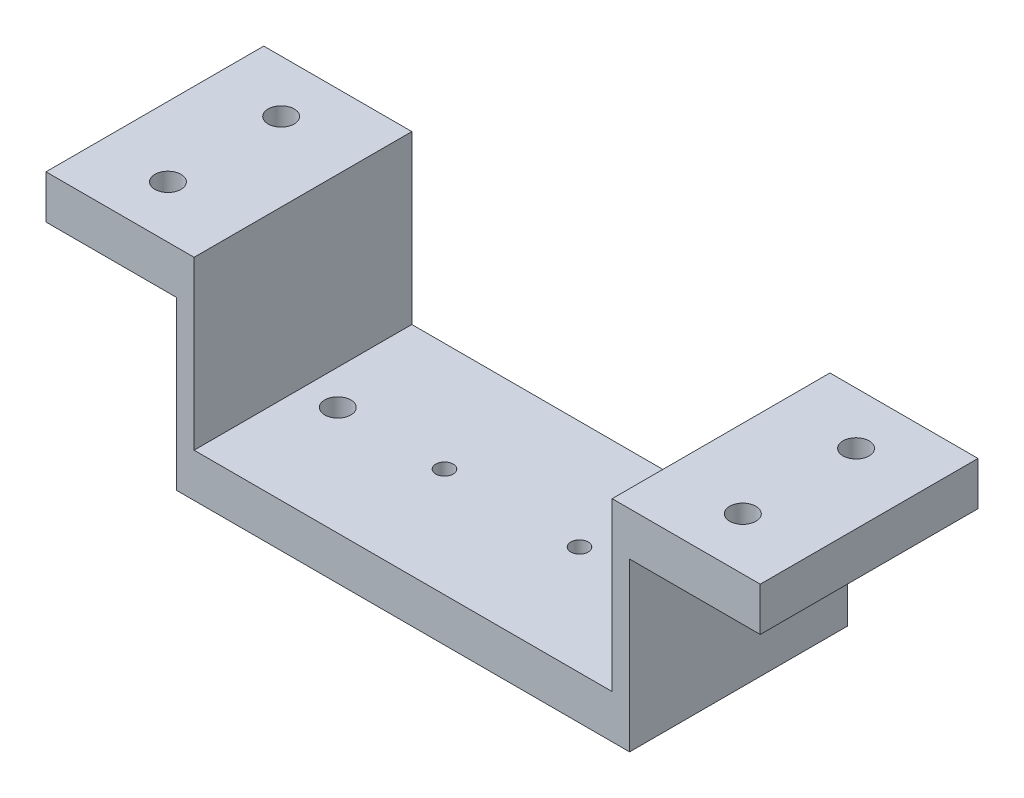
ISO-10303-21;
HEADER;
FILE_DESCRIPTION(('STEP AP214'),'2;1');
FILE_NAME('part.step','',(''),(''),'','','');
FILE_SCHEMA(('AUTOMOTIVE_DESIGN { 1 0 10303 214 1 1 1 1 }'));
ENDSEC;
DATA;
#1=APPLICATION_CONTEXT('core data for automotive mechanical design processes');
#2=APPLICATION_PROTOCOL_DEFINITION('international standard','automotive_design',2000,#1);
#3=PRODUCT_CONTEXT('',#1,'mechanical');
#4=PRODUCT('Part','Part','',(#3));
#5=PRODUCT_RELATED_PRODUCT_CATEGORY('part','',(#4));
#6=PRODUCT_DEFINITION_FORMATION('','',#4);
#7=PRODUCT_DEFINITION_CONTEXT('part definition',#1,'design');
#8=PRODUCT_DEFINITION('design','',#6,#7);
#9=PRODUCT_DEFINITION_SHAPE('','',#8);
#10=(LENGTH_UNIT() NAMED_UNIT(*) SI_UNIT(.MILLI.,.METRE.));
#11=(NAMED_UNIT(*) PLANE_ANGLE_UNIT() SI_UNIT($,.RADIAN.));
#12=(NAMED_UNIT(*) SI_UNIT($,.STERADIAN.) SOLID_ANGLE_UNIT());
#13=UNCERTAINTY_MEASURE_WITH_UNIT(LENGTH_MEASURE(1.E-05),#10,'distance_accuracy_value','');
#14=(GEOMETRIC_REPRESENTATION_CONTEXT(3) GLOBAL_UNCERTAINTY_ASSIGNED_CONTEXT((#13)) GLOBAL_UNIT_ASSIGNED_CONTEXT((#10,
#11,#12)) REPRESENTATION_CONTEXT('',''));
#15=CARTESIAN_POINT('',(0.,0.,0.));
#16=DIRECTION('',(0.,0.,1.));
#17=DIRECTION('',(1.,0.,0.));
#18=AXIS2_PLACEMENT_3D('',#15,#16,#17);
#19=CARTESIAN_POINT('',(26.,24.18,12.5));
#20=DIRECTION('',(-1.,0.,0.));
#21=DIRECTION('',(0.,0.,1.));
#22=AXIS2_PLACEMENT_3D('',#19,#20,#21);
#23=PLANE('',#22);
#24=DIRECTION('',(0.,0.,-1.));
#25=VECTOR('',#24,1.);
#26=CARTESIAN_POINT('',(26.,19.18,12.5));
#27=LINE('',#26,#25);
#28=CARTESIAN_POINT('',(26.,19.18,12.5));
#29=VERTEX_POINT('',#28);
#30=CARTESIAN_POINT('',(26.,19.18,-12.5));
#31=VERTEX_POINT('',#30);
#32=EDGE_CURVE('E59',#29,#31,#27,.T.);
#33=ORIENTED_EDGE('',*,*,#32,.F.);
#34=DIRECTION('',(0.,-1.,0.));
#35=VECTOR('',#34,1.);
#36=CARTESIAN_POINT('',(26.,24.18,12.5));
#37=LINE('',#36,#35);
#38=CARTESIAN_POINT('',(26.,0.,12.5));
#39=VERTEX_POINT('',#38);
#40=EDGE_CURVE('E138',#29,#39,#37,.T.);
#41=ORIENTED_EDGE('',*,*,#40,.T.);
#42=DIRECTION('',(0.,0.,-1.));
#43=VECTOR('',#42,1.);
#44=CARTESIAN_POINT('',(26.,0.,12.5));
#45=LINE('',#44,#43);
#46=CARTESIAN_POINT('',(26.,0.,-12.5));
#47=VERTEX_POINT('',#46);
#48=EDGE_CURVE('E227',#39,#47,#45,.T.);
#49=ORIENTED_EDGE('',*,*,#48,.T.);
#50=DIRECTION('',(0.,-1.,0.));
#51=VECTOR('',#50,1.);
#52=CARTESIAN_POINT('',(26.,24.18,-12.5));
#53=LINE('',#52,#51);
#54=EDGE_CURVE('E249',#31,#47,#53,.T.);
#55=ORIENTED_EDGE('',*,*,#54,.F.);
#56=EDGE_LOOP('',(#33,#41,#49,#55));
#57=FACE_BOUND('',#56,.T.);
#58=ADVANCED_FACE('F35',(#57),#23,.F.);
#59=CARTESIAN_POINT('',(0.,24.18,0.));
#60=DIRECTION('',(0.,-1.,0.));
#61=DIRECTION('',(0.,0.,-1.));
#62=AXIS2_PLACEMENT_3D('',#59,#60,#61);
#63=PLANE('',#62);
#64=CARTESIAN_POINT('',(33.,24.18,6.5));
#65=DIRECTION('',(0.,-1.,0.));
#66=DIRECTION('',(0.,0.,-1.));
#67=AXIS2_PLACEMENT_3D('',#64,#65,#66);
#68=CIRCLE('',#67,1.5);
#69=CARTESIAN_POINT('',(33.,24.18,5.));
#70=VERTEX_POINT('',#69);
#71=EDGE_CURVE('E164',#70,#70,#68,.T.);
#72=ORIENTED_EDGE('',*,*,#71,.T.);
#73=EDGE_LOOP('',(#72));
#74=FACE_BOUND('',#73,.T.);
#75=CARTESIAN_POINT('',(33.,24.18,-6.5));
#76=DIRECTION('',(0.,1.,0.));
#77=DIRECTION('',(0.,0.,1.));
#78=AXIS2_PLACEMENT_3D('',#75,#76,#77);
#79=CIRCLE('',#78,1.5);
#80=CARTESIAN_POINT('',(33.,24.18,-5.));
#81=VERTEX_POINT('',#80);
#82=EDGE_CURVE('E170',#81,#81,#79,.T.);
#83=ORIENTED_EDGE('',*,*,#82,.F.);
#84=EDGE_LOOP('',(#83));
#85=FACE_BOUND('',#84,.T.);
#86=DIRECTION('',(-1.,0.,0.));
#87=VECTOR('',#86,1.);
#88=CARTESIAN_POINT('',(-26.,24.18,-12.5));
#89=LINE('',#88,#87);
#90=CARTESIAN_POINT('',(41.,24.18,-12.5));
#91=VERTEX_POINT('',#90);
#92=CARTESIAN_POINT('',(24.,24.18,-12.5));
#93=VERTEX_POINT('',#92);
#94=EDGE_CURVE('E230',#91,#93,#89,.T.);
#95=ORIENTED_EDGE('',*,*,#94,.T.);
#96=DIRECTION('',(0.,0.,1.));
#97=VECTOR('',#96,1.);
#98=CARTESIAN_POINT('',(24.,24.18,0.));
#99=LINE('',#98,#97);
#100=CARTESIAN_POINT('',(24.,24.18,12.5));
#101=VERTEX_POINT('',#100);
#102=EDGE_CURVE('E11',#93,#101,#99,.T.);
#103=ORIENTED_EDGE('',*,*,#102,.T.);
#104=DIRECTION('',(1.,0.,0.));
#105=VECTOR('',#104,1.);
#106=CARTESIAN_POINT('',(-26.,24.18,12.5));
#107=LINE('',#106,#105);
#108=CARTESIAN_POINT('',(41.,24.18,12.5));
#109=VERTEX_POINT('',#108);
#110=EDGE_CURVE('E139',#101,#109,#107,.T.);
#111=ORIENTED_EDGE('',*,*,#110,.T.);
#112=DIRECTION('',(0.,0.,1.));
#113=VECTOR('',#112,1.);
#114=CARTESIAN_POINT('',(41.,24.18,12.5));
#115=LINE('',#114,#113);
#116=EDGE_CURVE('E184',#91,#109,#115,.T.);
#117=ORIENTED_EDGE('',*,*,#116,.F.);
#118=EDGE_LOOP('',(#95,#103,#111,#117));
#119=FACE_BOUND('',#118,.T.);
#120=ADVANCED_FACE('F278',(#74,#85,#119),#63,.F.);
#121=CARTESIAN_POINT('',(-26.,24.18,-12.5));
#122=DIRECTION('',(0.,0.,1.));
#123=DIRECTION('',(1.,0.,0.));
#124=AXIS2_PLACEMENT_3D('',#121,#122,#123);
#125=PLANE('',#124);
#126=DIRECTION('',(1.,0.,0.));
#127=VECTOR('',#126,1.);
#128=CARTESIAN_POINT('',(-24.,5.,-12.5));
#129=LINE('',#128,#127);
#130=CARTESIAN_POINT('',(-24.,5.,-12.5));
#131=VERTEX_POINT('',#130);
#132=CARTESIAN_POINT('',(24.,5.,-12.5));
#133=VERTEX_POINT('',#132);
#134=EDGE_CURVE('E216',#131,#133,#129,.T.);
#135=ORIENTED_EDGE('',*,*,#134,.T.);
#136=DIRECTION('',(0.,1.,0.));
#137=VECTOR('',#136,1.);
#138=CARTESIAN_POINT('',(24.,5.,-12.5));
#139=LINE('',#138,#137);
#140=EDGE_CURVE('E209',#133,#93,#139,.T.);
#141=ORIENTED_EDGE('',*,*,#140,.T.);
#142=ORIENTED_EDGE('',*,*,#94,.F.);
#143=DIRECTION('',(0.,1.,0.));
#144=VECTOR('',#143,1.);
#145=CARTESIAN_POINT('',(41.,24.18,-12.5));
#146=LINE('',#145,#144);
#147=CARTESIAN_POINT('',(41.,19.18,-12.5));
#148=VERTEX_POINT('',#147);
#149=EDGE_CURVE('E181',#148,#91,#146,.T.);
#150=ORIENTED_EDGE('',*,*,#149,.F.);
#151=DIRECTION('',(-1.,0.,0.));
#152=VECTOR('',#151,1.);
#153=CARTESIAN_POINT('',(41.,19.18,-12.5));
#154=LINE('',#153,#152);
#155=EDGE_CURVE('E187',#148,#31,#154,.T.);
#156=ORIENTED_EDGE('',*,*,#155,.T.);
#157=ORIENTED_EDGE('',*,*,#54,.T.);
#158=DIRECTION('',(-1.,0.,0.));
#159=VECTOR('',#158,1.);
#160=CARTESIAN_POINT('',(-26.,0.,-12.5));
#161=LINE('',#160,#159);
#162=CARTESIAN_POINT('',(-26.,0.,-12.5));
#163=VERTEX_POINT('',#162);
#164=EDGE_CURVE('E235',#47,#163,#161,.T.);
#165=ORIENTED_EDGE('',*,*,#164,.T.);
#166=DIRECTION('',(0.,-1.,0.));
#167=VECTOR('',#166,1.);
#168=CARTESIAN_POINT('',(-26.,24.18,-12.5));
#169=LINE('',#168,#167);
#170=CARTESIAN_POINT('',(-26.,19.18,-12.5));
#171=VERTEX_POINT('',#170);
#172=EDGE_CURVE('E247',#171,#163,#169,.T.);
#173=ORIENTED_EDGE('',*,*,#172,.F.);
#174=DIRECTION('',(1.,0.,0.));
#175=VECTOR('',#174,1.);
#176=CARTESIAN_POINT('',(-41.,19.18,-12.5));
#177=LINE('',#176,#175);
#178=CARTESIAN_POINT('',(-41.,19.18,-12.5));
#179=VERTEX_POINT('',#178);
#180=EDGE_CURVE('E51',#179,#171,#177,.T.);
#181=ORIENTED_EDGE('',*,*,#180,.F.);
#182=DIRECTION('',(0.,1.,0.));
#183=VECTOR('',#182,1.);
#184=CARTESIAN_POINT('',(-41.,24.18,-12.5));
#185=LINE('',#184,#183);
#186=CARTESIAN_POINT('',(-41.,24.18,-12.5));
#187=VERTEX_POINT('',#186);
#188=EDGE_CURVE('E153',#179,#187,#185,.T.);
#189=ORIENTED_EDGE('',*,*,#188,.T.);
#190=CARTESIAN_POINT('',(-24.,24.18,-12.5));
#191=VERTEX_POINT('',#190);
#192=EDGE_CURVE('E152',#191,#187,#89,.T.);
#193=ORIENTED_EDGE('',*,*,#192,.F.);
#194=DIRECTION('',(0.,-1.,0.));
#195=VECTOR('',#194,1.);
#196=CARTESIAN_POINT('',(-24.,5.,-12.5));
#197=LINE('',#196,#195);
#198=EDGE_CURVE('E212',#191,#131,#197,.T.);
#199=ORIENTED_EDGE('',*,*,#198,.T.);
#200=EDGE_LOOP('',(#135,#141,#142,#150,#156,#157,#165,#173,#181,#189,#193,#199));
#201=FACE_BOUND('',#200,.T.);
#202=ADVANCED_FACE('F282',(#201),#125,.F.);
#203=CARTESIAN_POINT('',(-26.,24.18,12.5));
#204=DIRECTION('',(1.,0.,0.));
#205=DIRECTION('',(0.,0.,-1.));
#206=AXIS2_PLACEMENT_3D('',#203,#204,#205);
#207=PLANE('',#206);
#208=DIRECTION('',(0.,-1.,0.));
#209=VECTOR('',#208,1.);
#210=CARTESIAN_POINT('',(-26.,24.18,12.5));
#211=LINE('',#210,#209);
#212=CARTESIAN_POINT('',(-26.,19.18,12.5));
#213=VERTEX_POINT('',#212);
#214=CARTESIAN_POINT('',(-26.,0.,12.5));
#215=VERTEX_POINT('',#214);
#216=EDGE_CURVE('E245',#213,#215,#211,.T.);
#217=ORIENTED_EDGE('',*,*,#216,.F.);
#218=DIRECTION('',(0.,0.,-1.));
#219=VECTOR('',#218,1.);
#220=CARTESIAN_POINT('',(-26.,19.18,12.5));
#221=LINE('',#220,#219);
#222=EDGE_CURVE('E148',#213,#171,#221,.T.);
#223=ORIENTED_EDGE('',*,*,#222,.T.);
#224=ORIENTED_EDGE('',*,*,#172,.T.);
#225=DIRECTION('',(0.,0.,1.));
#226=VECTOR('',#225,1.);
#227=CARTESIAN_POINT('',(-26.,0.,12.5));
#228=LINE('',#227,#226);
#229=EDGE_CURVE('E238',#163,#215,#228,.T.);
#230=ORIENTED_EDGE('',*,*,#229,.T.);
#231=EDGE_LOOP('',(#217,#223,#224,#230));
#232=FACE_BOUND('',#231,.T.);
#233=ADVANCED_FACE('F288',(#232),#207,.F.);
#234=CARTESIAN_POINT('',(-26.,24.18,12.5));
#235=DIRECTION('',(0.,0.,-1.));
#236=DIRECTION('',(-1.,0.,0.));
#237=AXIS2_PLACEMENT_3D('',#234,#235,#236);
#238=PLANE('',#237);
#239=ORIENTED_EDGE('',*,*,#110,.F.);
#240=DIRECTION('',(0.,1.,0.));
#241=VECTOR('',#240,1.);
#242=CARTESIAN_POINT('',(24.,5.,12.5));
#243=LINE('',#242,#241);
#244=CARTESIAN_POINT('',(24.,5.,12.5));
#245=VERTEX_POINT('',#244);
#246=EDGE_CURVE('E220',#245,#101,#243,.T.);
#247=ORIENTED_EDGE('',*,*,#246,.F.);
#248=DIRECTION('',(1.,0.,0.));
#249=VECTOR('',#248,1.);
#250=CARTESIAN_POINT('',(-24.,5.,12.5));
#251=LINE('',#250,#249);
#252=CARTESIAN_POINT('',(-24.,5.,12.5));
#253=VERTEX_POINT('',#252);
#254=EDGE_CURVE('E213',#253,#245,#251,.T.);
#255=ORIENTED_EDGE('',*,*,#254,.F.);
#256=DIRECTION('',(0.,-1.,0.));
#257=VECTOR('',#256,1.);
#258=CARTESIAN_POINT('',(-24.,5.,12.5));
#259=LINE('',#258,#257);
#260=CARTESIAN_POINT('',(-24.,24.18,12.5));
#261=VERTEX_POINT('',#260);
#262=EDGE_CURVE('E134',#261,#253,#259,.T.);
#263=ORIENTED_EDGE('',*,*,#262,.F.);
#264=CARTESIAN_POINT('',(-41.,24.18,12.5));
#265=VERTEX_POINT('',#264);
#266=EDGE_CURVE('E127',#265,#261,#107,.T.);
#267=ORIENTED_EDGE('',*,*,#266,.F.);
#268=DIRECTION('',(0.,-1.,0.));
#269=VECTOR('',#268,1.);
#270=CARTESIAN_POINT('',(-41.,24.18,12.5));
#271=LINE('',#270,#269);
#272=CARTESIAN_POINT('',(-41.,19.18,12.5));
#273=VERTEX_POINT('',#272);
#274=EDGE_CURVE('E131',#265,#273,#271,.T.);
#275=ORIENTED_EDGE('',*,*,#274,.T.);
#276=DIRECTION('',(1.,0.,0.));
#277=VECTOR('',#276,1.);
#278=CARTESIAN_POINT('',(-41.,19.18,12.5));
#279=LINE('',#278,#277);
#280=EDGE_CURVE('E159',#273,#213,#279,.T.);
#281=ORIENTED_EDGE('',*,*,#280,.T.);
#282=ORIENTED_EDGE('',*,*,#216,.T.);
#283=DIRECTION('',(1.,0.,0.));
#284=VECTOR('',#283,1.);
#285=CARTESIAN_POINT('',(-26.,0.,12.5));
#286=LINE('',#285,#284);
#287=EDGE_CURVE('E241',#215,#39,#286,.T.);
#288=ORIENTED_EDGE('',*,*,#287,.T.);
#289=ORIENTED_EDGE('',*,*,#40,.F.);
#290=DIRECTION('',(-1.,0.,0.));
#291=VECTOR('',#290,1.);
#292=CARTESIAN_POINT('',(41.,19.18,12.5));
#293=LINE('',#292,#291);
#294=CARTESIAN_POINT('',(41.,19.18,12.5));
#295=VERTEX_POINT('',#294);
#296=EDGE_CURVE('E191',#295,#29,#293,.T.);
#297=ORIENTED_EDGE('',*,*,#296,.F.);
#298=DIRECTION('',(0.,-1.,0.));
#299=VECTOR('',#298,1.);
#300=CARTESIAN_POINT('',(41.,24.18,12.5));
#301=LINE('',#300,#299);
#302=EDGE_CURVE('E176',#109,#295,#301,.T.);
#303=ORIENTED_EDGE('',*,*,#302,.F.);
#304=EDGE_LOOP('',(#239,#247,#255,#263,#267,#275,#281,#282,#288,#289,#297,#303));
#305=FACE_BOUND('',#304,.T.);
#306=ADVANCED_FACE('F130',(#305),#238,.F.);
#307=CARTESIAN_POINT('',(-33.,24.18,6.5));
#308=DIRECTION('',(0.,1.,0.));
#309=DIRECTION('',(0.,0.,-1.));
#310=AXIS2_PLACEMENT_3D('',#307,#308,#309);
#311=CIRCLE('',#310,1.5);
#312=CARTESIAN_POINT('',(-33.,24.18,5.));
#313=VERTEX_POINT('',#312);
#314=EDGE_CURVE('E306',#313,#313,#311,.T.);
#315=ORIENTED_EDGE('',*,*,#314,.F.);
#316=EDGE_LOOP('',(#315));
#317=FACE_BOUND('',#316,.T.);
#318=CARTESIAN_POINT('',(-33.,24.18,-6.5));
#319=DIRECTION('',(0.,-1.,0.));
#320=DIRECTION('',(0.,0.,1.));
#321=AXIS2_PLACEMENT_3D('',#318,#319,#320);
#322=CIRCLE('',#321,1.5);
#323=CARTESIAN_POINT('',(-33.,24.18,-5.));
#324=VERTEX_POINT('',#323);
#325=EDGE_CURVE('E309',#324,#324,#322,.T.);
#326=ORIENTED_EDGE('',*,*,#325,.T.);
#327=EDGE_LOOP('',(#326));
#328=FACE_BOUND('',#327,.T.);
#329=ORIENTED_EDGE('',*,*,#266,.T.);
#330=DIRECTION('',(0.,0.,-1.));
#331=VECTOR('',#330,1.);
#332=CARTESIAN_POINT('',(-24.,24.18,0.));
#333=LINE('',#332,#331);
#334=EDGE_CURVE('E43',#261,#191,#333,.T.);
#335=ORIENTED_EDGE('',*,*,#334,.T.);
#336=ORIENTED_EDGE('',*,*,#192,.T.);
#337=DIRECTION('',(0.,0.,1.));
#338=VECTOR('',#337,1.);
#339=CARTESIAN_POINT('',(-41.,24.18,12.5));
#340=LINE('',#339,#338);
#341=EDGE_CURVE('E145',#187,#265,#340,.T.);
#342=ORIENTED_EDGE('',*,*,#341,.T.);
#343=EDGE_LOOP('',(#329,#335,#336,#342));
#344=FACE_BOUND('',#343,.T.);
#345=ADVANCED_FACE('F150',(#317,#328,#344),#63,.F.);
#346=CARTESIAN_POINT('',(0.,0.,0.));
#347=DIRECTION('',(0.,-1.,0.));
#348=DIRECTION('',(0.,0.,-1.));
#349=AXIS2_PLACEMENT_3D('',#346,#347,#348);
#350=PLANE('',#349);
#351=CARTESIAN_POINT('',(20.,0.,0.));
#352=DIRECTION('',(0.,-1.,0.));
#353=DIRECTION('',(0.,0.,-1.));
#354=AXIS2_PLACEMENT_3D('',#351,#352,#353);
#355=CIRCLE('',#354,1.5);
#356=CARTESIAN_POINT('',(20.,0.,-1.5));
#357=VERTEX_POINT('',#356);
#358=EDGE_CURVE('E194',#357,#357,#355,.T.);
#359=ORIENTED_EDGE('',*,*,#358,.F.);
#360=EDGE_LOOP('',(#359));
#361=FACE_BOUND('',#360,.T.);
#362=CARTESIAN_POINT('',(7.75,0.,0.));
#363=DIRECTION('',(0.,-1.,0.));
#364=DIRECTION('',(0.,0.,-1.));
#365=AXIS2_PLACEMENT_3D('',#362,#363,#364);
#366=CIRCLE('',#365,1.);
#367=CARTESIAN_POINT('',(7.75,0.,-1.));
#368=VERTEX_POINT('',#367);
#369=EDGE_CURVE('E197',#368,#368,#366,.T.);
#370=ORIENTED_EDGE('',*,*,#369,.F.);
#371=EDGE_LOOP('',(#370));
#372=FACE_BOUND('',#371,.T.);
#373=CARTESIAN_POINT('',(-20.,0.,0.));
#374=DIRECTION('',(0.,-1.,0.));
#375=DIRECTION('',(0.,0.,-1.));
#376=AXIS2_PLACEMENT_3D('',#373,#374,#375);
#377=CIRCLE('',#376,1.5);
#378=CARTESIAN_POINT('',(-20.,0.,-1.5));
#379=VERTEX_POINT('',#378);
#380=EDGE_CURVE('E201',#379,#379,#377,.T.);
#381=ORIENTED_EDGE('',*,*,#380,.F.);
#382=EDGE_LOOP('',(#381));
#383=FACE_BOUND('',#382,.T.);
#384=CARTESIAN_POINT('',(-7.75,0.,0.));
#385=DIRECTION('',(0.,-1.,0.));
#386=DIRECTION('',(0.,0.,-1.));
#387=AXIS2_PLACEMENT_3D('',#384,#385,#386);
#388=CIRCLE('',#387,1.);
#389=CARTESIAN_POINT('',(-7.75,0.,-1.));
#390=VERTEX_POINT('',#389);
#391=EDGE_CURVE('E205',#390,#390,#388,.T.);
#392=ORIENTED_EDGE('',*,*,#391,.F.);
#393=EDGE_LOOP('',(#392));
#394=FACE_BOUND('',#393,.T.);
#395=ORIENTED_EDGE('',*,*,#48,.F.);
#396=ORIENTED_EDGE('',*,*,#287,.F.);
#397=ORIENTED_EDGE('',*,*,#229,.F.);
#398=ORIENTED_EDGE('',*,*,#164,.F.);
#399=EDGE_LOOP('',(#395,#396,#397,#398));
#400=FACE_BOUND('',#399,.T.);
#401=ADVANCED_FACE('F294',(#361,#372,#383,#394,#400),#350,.T.);
#402=CARTESIAN_POINT('',(24.,5.,-12.5));
#403=DIRECTION('',(1.,0.,0.));
#404=DIRECTION('',(0.,0.,-1.));
#405=AXIS2_PLACEMENT_3D('',#402,#403,#404);
#406=PLANE('',#405);
#407=ORIENTED_EDGE('',*,*,#140,.F.);
#408=DIRECTION('',(0.,0.,1.));
#409=VECTOR('',#408,1.);
#410=CARTESIAN_POINT('',(24.,5.,-12.5));
#411=LINE('',#410,#409);
#412=EDGE_CURVE('E225',#133,#245,#411,.T.);
#413=ORIENTED_EDGE('',*,*,#412,.T.);
#414=ORIENTED_EDGE('',*,*,#246,.T.);
#415=ORIENTED_EDGE('',*,*,#102,.F.);
#416=EDGE_LOOP('',(#407,#413,#414,#415));
#417=FACE_BOUND('',#416,.T.);
#418=ADVANCED_FACE('F300',(#417),#406,.F.);
#419=CARTESIAN_POINT('',(-24.,5.,-12.5));
#420=DIRECTION('',(-1.,0.,0.));
#421=DIRECTION('',(0.,0.,1.));
#422=AXIS2_PLACEMENT_3D('',#419,#420,#421);
#423=PLANE('',#422);
#424=ORIENTED_EDGE('',*,*,#262,.T.);
#425=DIRECTION('',(0.,0.,1.));
#426=VECTOR('',#425,1.);
#427=CARTESIAN_POINT('',(-24.,5.,-12.5));
#428=LINE('',#427,#426);
#429=EDGE_CURVE('E219',#131,#253,#428,.T.);
#430=ORIENTED_EDGE('',*,*,#429,.F.);
#431=ORIENTED_EDGE('',*,*,#198,.F.);
#432=ORIENTED_EDGE('',*,*,#334,.F.);
#433=EDGE_LOOP('',(#424,#430,#431,#432));
#434=FACE_BOUND('',#433,.T.);
#435=ADVANCED_FACE('F463',(#434),#423,.F.);
#436=CARTESIAN_POINT('',(-24.,5.,-12.5));
#437=DIRECTION('',(0.,-1.,0.));
#438=DIRECTION('',(0.,0.,-1.));
#439=AXIS2_PLACEMENT_3D('',#436,#437,#438);
#440=PLANE('',#439);
#441=CARTESIAN_POINT('',(20.,5.,0.));
#442=DIRECTION('',(0.,-1.,0.));
#443=DIRECTION('',(0.,0.,-1.));
#444=AXIS2_PLACEMENT_3D('',#441,#442,#443);
#445=CIRCLE('',#444,1.5);
#446=CARTESIAN_POINT('',(20.,5.,-1.5));
#447=VERTEX_POINT('',#446);
#448=EDGE_CURVE('E38',#447,#447,#445,.T.);
#449=ORIENTED_EDGE('',*,*,#448,.T.);
#450=EDGE_LOOP('',(#449));
#451=FACE_BOUND('',#450,.T.);
#452=CARTESIAN_POINT('',(7.75,5.,0.));
#453=DIRECTION('',(0.,-1.,0.));
#454=DIRECTION('',(0.,0.,-1.));
#455=AXIS2_PLACEMENT_3D('',#452,#453,#454);
#456=CIRCLE('',#455,1.);
#457=CARTESIAN_POINT('',(7.75,5.,-1.));
#458=VERTEX_POINT('',#457);
#459=EDGE_CURVE('E200',#458,#458,#456,.T.);
#460=ORIENTED_EDGE('',*,*,#459,.T.);
#461=EDGE_LOOP('',(#460));
#462=FACE_BOUND('',#461,.T.);
#463=CARTESIAN_POINT('',(-20.,5.,0.));
#464=DIRECTION('',(0.,-1.,0.));
#465=DIRECTION('',(0.,0.,-1.));
#466=AXIS2_PLACEMENT_3D('',#463,#464,#465);
#467=CIRCLE('',#466,1.5);
#468=CARTESIAN_POINT('',(-20.,5.,-1.5));
#469=VERTEX_POINT('',#468);
#470=EDGE_CURVE('E204',#469,#469,#467,.T.);
#471=ORIENTED_EDGE('',*,*,#470,.T.);
#472=EDGE_LOOP('',(#471));
#473=FACE_BOUND('',#472,.T.);
#474=CARTESIAN_POINT('',(-7.75,5.,0.));
#475=DIRECTION('',(0.,-1.,0.));
#476=DIRECTION('',(0.,0.,-1.));
#477=AXIS2_PLACEMENT_3D('',#474,#475,#476);
#478=CIRCLE('',#477,1.);
#479=CARTESIAN_POINT('',(-7.75,5.,-1.));
#480=VERTEX_POINT('',#479);
#481=EDGE_CURVE('E208',#480,#480,#478,.T.);
#482=ORIENTED_EDGE('',*,*,#481,.T.);
#483=EDGE_LOOP('',(#482));
#484=FACE_BOUND('',#483,.T.);
#485=ORIENTED_EDGE('',*,*,#254,.T.);
#486=ORIENTED_EDGE('',*,*,#412,.F.);
#487=ORIENTED_EDGE('',*,*,#134,.F.);
#488=ORIENTED_EDGE('',*,*,#429,.T.);
#489=EDGE_LOOP('',(#485,#486,#487,#488));
#490=FACE_BOUND('',#489,.T.);
#491=ADVANCED_FACE('F258',(#451,#462,#473,#484,#490),#440,.F.);
#492=CARTESIAN_POINT('',(-7.75,24.18,0.));
#493=DIRECTION('',(0.,-1.,0.));
#494=DIRECTION('',(0.,0.,-1.));
#495=AXIS2_PLACEMENT_3D('',#492,#493,#494);
#496=CYLINDRICAL_SURFACE('',#495,1.);
#497=ORIENTED_EDGE('',*,*,#391,.T.);
#498=EDGE_LOOP('',(#497));
#499=FACE_BOUND('',#498,.T.);
#500=ORIENTED_EDGE('',*,*,#481,.F.);
#501=EDGE_LOOP('',(#500));
#502=FACE_BOUND('',#501,.T.);
#503=ADVANCED_FACE('F274',(#499,#502),#496,.F.);
#504=CARTESIAN_POINT('',(-20.,24.18,0.));
#505=DIRECTION('',(0.,-1.,0.));
#506=DIRECTION('',(0.,0.,-1.));
#507=AXIS2_PLACEMENT_3D('',#504,#505,#506);
#508=CYLINDRICAL_SURFACE('',#507,1.5);
#509=ORIENTED_EDGE('',*,*,#380,.T.);
#510=EDGE_LOOP('',(#509));
#511=FACE_BOUND('',#510,.T.);
#512=ORIENTED_EDGE('',*,*,#470,.F.);
#513=EDGE_LOOP('',(#512));
#514=FACE_BOUND('',#513,.T.);
#515=ADVANCED_FACE('F264',(#511,#514),#508,.F.);
#516=CARTESIAN_POINT('',(7.75,24.18,0.));
#517=DIRECTION('',(0.,-1.,0.));
#518=DIRECTION('',(0.,0.,-1.));
#519=AXIS2_PLACEMENT_3D('',#516,#517,#518);
#520=CYLINDRICAL_SURFACE('',#519,1.);
#521=ORIENTED_EDGE('',*,*,#369,.T.);
#522=EDGE_LOOP('',(#521));
#523=FACE_BOUND('',#522,.T.);
#524=ORIENTED_EDGE('',*,*,#459,.F.);
#525=EDGE_LOOP('',(#524));
#526=FACE_BOUND('',#525,.T.);
#527=ADVANCED_FACE('F261',(#523,#526),#520,.F.);
#528=CARTESIAN_POINT('',(20.,24.18,0.));
#529=DIRECTION('',(0.,-1.,0.));
#530=DIRECTION('',(0.,0.,-1.));
#531=AXIS2_PLACEMENT_3D('',#528,#529,#530);
#532=CYLINDRICAL_SURFACE('',#531,1.5);
#533=ORIENTED_EDGE('',*,*,#358,.T.);
#534=EDGE_LOOP('',(#533));
#535=FACE_BOUND('',#534,.T.);
#536=ORIENTED_EDGE('',*,*,#448,.F.);
#537=EDGE_LOOP('',(#536));
#538=FACE_BOUND('',#537,.T.);
#539=ADVANCED_FACE('F263',(#535,#538),#532,.F.);
#540=CARTESIAN_POINT('',(41.,19.18,12.5));
#541=DIRECTION('',(0.,1.,0.));
#542=DIRECTION('',(0.,0.,1.));
#543=AXIS2_PLACEMENT_3D('',#540,#541,#542);
#544=PLANE('',#543);
#545=CARTESIAN_POINT('',(33.,19.18,6.5));
#546=DIRECTION('',(0.,1.,0.));
#547=DIRECTION('',(0.,0.,1.));
#548=AXIS2_PLACEMENT_3D('',#545,#546,#547);
#549=CIRCLE('',#548,1.5);
#550=CARTESIAN_POINT('',(33.,19.18,8.));
#551=VERTEX_POINT('',#550);
#552=EDGE_CURVE('E167',#551,#551,#549,.T.);
#553=ORIENTED_EDGE('',*,*,#552,.T.);
#554=EDGE_LOOP('',(#553));
#555=FACE_BOUND('',#554,.T.);
#556=CARTESIAN_POINT('',(33.,19.18,-6.5));
#557=DIRECTION('',(0.,1.,0.));
#558=DIRECTION('',(0.,0.,1.));
#559=AXIS2_PLACEMENT_3D('',#556,#557,#558);
#560=CIRCLE('',#559,1.5);
#561=CARTESIAN_POINT('',(33.,19.18,-5.));
#562=VERTEX_POINT('',#561);
#563=EDGE_CURVE('E173',#562,#562,#560,.F.);
#564=ORIENTED_EDGE('',*,*,#563,.F.);
#565=EDGE_LOOP('',(#564));
#566=FACE_BOUND('',#565,.T.);
#567=ORIENTED_EDGE('',*,*,#32,.T.);
#568=ORIENTED_EDGE('',*,*,#155,.F.);
#569=DIRECTION('',(0.,0.,-1.));
#570=VECTOR('',#569,1.);
#571=CARTESIAN_POINT('',(41.,19.18,12.5));
#572=LINE('',#571,#570);
#573=EDGE_CURVE('E179',#295,#148,#572,.T.);
#574=ORIENTED_EDGE('',*,*,#573,.F.);
#575=ORIENTED_EDGE('',*,*,#296,.T.);
#576=EDGE_LOOP('',(#567,#568,#574,#575));
#577=FACE_BOUND('',#576,.T.);
#578=ADVANCED_FACE('F271',(#555,#566,#577),#544,.F.);
#579=CARTESIAN_POINT('',(41.,0.,0.));
#580=DIRECTION('',(1.,0.,0.));
#581=DIRECTION('',(0.,0.,-1.));
#582=AXIS2_PLACEMENT_3D('',#579,#580,#581);
#583=PLANE('',#582);
#584=ORIENTED_EDGE('',*,*,#302,.T.);
#585=ORIENTED_EDGE('',*,*,#573,.T.);
#586=ORIENTED_EDGE('',*,*,#149,.T.);
#587=ORIENTED_EDGE('',*,*,#116,.T.);
#588=EDGE_LOOP('',(#584,#585,#586,#587));
#589=FACE_BOUND('',#588,.T.);
#590=ADVANCED_FACE('F342',(#589),#583,.T.);
#591=CARTESIAN_POINT('',(33.,14.9373593128807,-6.5));
#592=DIRECTION('',(0.,1.,0.));
#593=DIRECTION('',(0.,0.,1.));
#594=AXIS2_PLACEMENT_3D('',#591,#592,#593);
#595=CYLINDRICAL_SURFACE('',#594,1.5);
#596=ORIENTED_EDGE('',*,*,#563,.T.);
#597=EDGE_LOOP('',(#596));
#598=FACE_BOUND('',#597,.T.);
#599=ORIENTED_EDGE('',*,*,#82,.T.);
#600=EDGE_LOOP('',(#599));
#601=FACE_BOUND('',#600,.T.);
#602=ADVANCED_FACE('F338',(#598,#601),#595,.F.);
#603=CARTESIAN_POINT('',(33.,14.9373593128807,6.5));
#604=DIRECTION('',(0.,1.,0.));
#605=DIRECTION('',(0.,0.,1.));
#606=AXIS2_PLACEMENT_3D('',#603,#604,#605);
#607=CYLINDRICAL_SURFACE('',#606,1.5);
#608=ORIENTED_EDGE('',*,*,#552,.F.);
#609=EDGE_LOOP('',(#608));
#610=FACE_BOUND('',#609,.T.);
#611=ORIENTED_EDGE('',*,*,#71,.F.);
#612=EDGE_LOOP('',(#611));
#613=FACE_BOUND('',#612,.T.);
#614=ADVANCED_FACE('F334',(#610,#613),#607,.F.);
#615=CARTESIAN_POINT('',(-41.,19.18,12.5));
#616=DIRECTION('',(0.,-1.,0.));
#617=DIRECTION('',(0.,0.,-1.));
#618=AXIS2_PLACEMENT_3D('',#615,#616,#617);
#619=PLANE('',#618);
#620=CARTESIAN_POINT('',(-33.,19.18,6.5));
#621=DIRECTION('',(0.,1.,0.));
#622=DIRECTION('',(0.,0.,1.));
#623=AXIS2_PLACEMENT_3D('',#620,#621,#622);
#624=CIRCLE('',#623,1.5);
#625=CARTESIAN_POINT('',(-33.,19.18,8.));
#626=VERTEX_POINT('',#625);
#627=EDGE_CURVE('E311',#626,#626,#624,.F.);
#628=ORIENTED_EDGE('',*,*,#627,.F.);
#629=EDGE_LOOP('',(#628));
#630=FACE_BOUND('',#629,.T.);
#631=CARTESIAN_POINT('',(-33.,19.18,-6.5));
#632=DIRECTION('',(0.,1.,0.));
#633=DIRECTION('',(0.,0.,1.));
#634=AXIS2_PLACEMENT_3D('',#631,#632,#633);
#635=CIRCLE('',#634,1.5);
#636=CARTESIAN_POINT('',(-33.,19.18,-5.));
#637=VERTEX_POINT('',#636);
#638=EDGE_CURVE('E161',#637,#637,#635,.T.);
#639=ORIENTED_EDGE('',*,*,#638,.T.);
#640=EDGE_LOOP('',(#639));
#641=FACE_BOUND('',#640,.T.);
#642=ORIENTED_EDGE('',*,*,#222,.F.);
#643=ORIENTED_EDGE('',*,*,#280,.F.);
#644=DIRECTION('',(0.,0.,-1.));
#645=VECTOR('',#644,1.);
#646=CARTESIAN_POINT('',(-41.,19.18,12.5));
#647=LINE('',#646,#645);
#648=EDGE_CURVE('E147',#273,#179,#647,.T.);
#649=ORIENTED_EDGE('',*,*,#648,.T.);
#650=ORIENTED_EDGE('',*,*,#180,.T.);
#651=EDGE_LOOP('',(#642,#643,#649,#650));
#652=FACE_BOUND('',#651,.T.);
#653=ADVANCED_FACE('F331',(#630,#641,#652),#619,.T.);
#654=CARTESIAN_POINT('',(-41.,0.,0.));
#655=DIRECTION('',(-1.,0.,0.));
#656=DIRECTION('',(0.,0.,-1.));
#657=AXIS2_PLACEMENT_3D('',#654,#655,#656);
#658=PLANE('',#657);
#659=ORIENTED_EDGE('',*,*,#274,.F.);
#660=ORIENTED_EDGE('',*,*,#341,.F.);
#661=ORIENTED_EDGE('',*,*,#188,.F.);
#662=ORIENTED_EDGE('',*,*,#648,.F.);
#663=EDGE_LOOP('',(#659,#660,#661,#662));
#664=FACE_BOUND('',#663,.T.);
#665=ADVANCED_FACE('F143',(#664),#658,.T.);
#666=CARTESIAN_POINT('',(-33.,14.9373593128807,-6.5));
#667=DIRECTION('',(0.,1.,0.));
#668=DIRECTION('',(0.,0.,1.));
#669=AXIS2_PLACEMENT_3D('',#666,#667,#668);
#670=CYLINDRICAL_SURFACE('',#669,1.5);
#671=ORIENTED_EDGE('',*,*,#638,.F.);
#672=EDGE_LOOP('',(#671));
#673=FACE_BOUND('',#672,.T.);
#674=ORIENTED_EDGE('',*,*,#325,.F.);
#675=EDGE_LOOP('',(#674));
#676=FACE_BOUND('',#675,.T.);
#677=ADVANCED_FACE('F320',(#673,#676),#670,.F.);
#678=CARTESIAN_POINT('',(-33.,14.9373593128807,6.5));
#679=DIRECTION('',(0.,1.,0.));
#680=DIRECTION('',(0.,0.,1.));
#681=AXIS2_PLACEMENT_3D('',#678,#679,#680);
#682=CYLINDRICAL_SURFACE('',#681,1.5);
#683=ORIENTED_EDGE('',*,*,#627,.T.);
#684=EDGE_LOOP('',(#683));
#685=FACE_BOUND('',#684,.T.);
#686=ORIENTED_EDGE('',*,*,#314,.T.);
#687=EDGE_LOOP('',(#686));
#688=FACE_BOUND('',#687,.T.);
#689=ADVANCED_FACE('F318',(#685,#688),#682,.F.);
#690=CLOSED_SHELL('',(#58,#120,#202,#233,#306,#345,#401,#418,#435,#491,#503,#515,#527,#539,#578,
#590,#602,#614,#653,#665,#677,#689));
#691=MANIFOLD_SOLID_BREP('B2',#690);
#692=ADVANCED_BREP_SHAPE_REPRESENTATION('',(#18,#691),#14);
#693=SHAPE_DEFINITION_REPRESENTATION(#9,#692);
ENDSEC;
END-ISO-10303-21;
